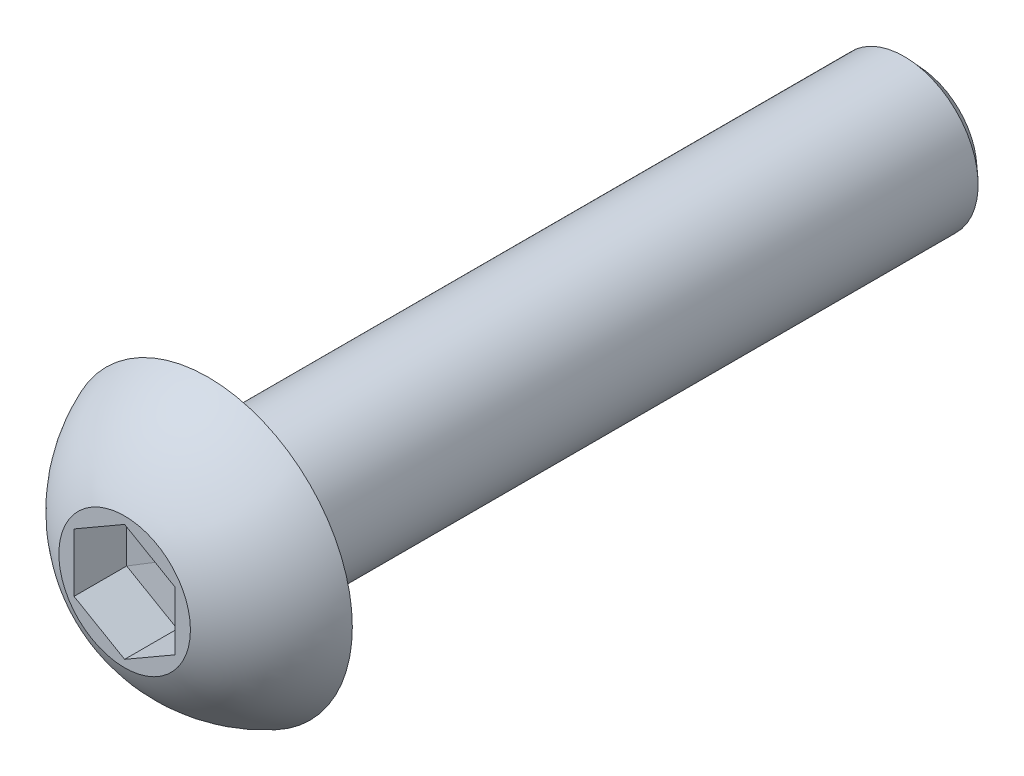
ISO-10303-21;
HEADER;
FILE_DESCRIPTION(('STEP AP214'),'2;1');
FILE_NAME('part.step','',(''),(''),'','','');
FILE_SCHEMA(('AUTOMOTIVE_DESIGN { 1 0 10303 214 1 1 1 1 }'));
ENDSEC;
DATA;
#1=APPLICATION_CONTEXT('core data for automotive mechanical design processes');
#2=APPLICATION_PROTOCOL_DEFINITION('international standard','automotive_design',2000,#1);
#3=PRODUCT_CONTEXT('',#1,'mechanical');
#4=PRODUCT('Part','Part','',(#3));
#5=PRODUCT_RELATED_PRODUCT_CATEGORY('part','',(#4));
#6=PRODUCT_DEFINITION_FORMATION('','',#4);
#7=PRODUCT_DEFINITION_CONTEXT('part definition',#1,'design');
#8=PRODUCT_DEFINITION('design','',#6,#7);
#9=PRODUCT_DEFINITION_SHAPE('','',#8);
#10=(LENGTH_UNIT() NAMED_UNIT(*) SI_UNIT(.MILLI.,.METRE.));
#11=(NAMED_UNIT(*) PLANE_ANGLE_UNIT() SI_UNIT($,.RADIAN.));
#12=(NAMED_UNIT(*) SI_UNIT($,.STERADIAN.) SOLID_ANGLE_UNIT());
#13=UNCERTAINTY_MEASURE_WITH_UNIT(LENGTH_MEASURE(1.E-05),#10,'distance_accuracy_value','');
#14=(GEOMETRIC_REPRESENTATION_CONTEXT(3) GLOBAL_UNCERTAINTY_ASSIGNED_CONTEXT((#13)) GLOBAL_UNIT_ASSIGNED_CONTEXT((#10,
#11,#12)) REPRESENTATION_CONTEXT('',''));
#15=CARTESIAN_POINT('',(0.,0.,0.));
#16=DIRECTION('',(0.,0.,1.));
#17=DIRECTION('',(1.,0.,0.));
#18=AXIS2_PLACEMENT_3D('',#15,#16,#17);
#19=CARTESIAN_POINT('',(0.,0.,-1.12424242424294));
#20=DIRECTION('',(0.,0.,1.));
#21=DIRECTION('',(1.,0.,0.));
#22=AXIS2_PLACEMENT_3D('',#19,#20,#21);
#23=SPHERICAL_SURFACE('',#22,3.06372665694355);
#24=CARTESIAN_POINT('',(0.,0.,-5.09960734214414E-13));
#25=DIRECTION('',(0.,0.,-1.));
#26=DIRECTION('',(1.,0.,0.));
#27=AXIS2_PLACEMENT_3D('',#24,#25,#26);
#28=CIRCLE('',#27,2.85);
#29=CARTESIAN_POINT('',(2.85,0.,-5.10659223240673E-13));
#30=VERTEX_POINT('',#29);
#31=EDGE_CURVE('E145',#30,#30,#28,.T.);
#32=CARTESIAN_POINT('',(0.,0.,1.64999999999949));
#33=DIRECTION('',(0.,0.,-1.));
#34=DIRECTION('',(1.,0.,0.));
#35=AXIS2_PLACEMENT_3D('',#32,#33,#34);
#36=CIRCLE('',#35,1.3);
#37=CARTESIAN_POINT('',(1.3,0.,1.64999999999949));
#38=VERTEX_POINT('',#37);
#39=EDGE_CURVE('E11',#38,#38,#36,.T.);
#40=CARTESIAN_POINT('',(2.85,0.,-5.10659223240673E-13));
#41=CARTESIAN_POINT('',(2.84113663386439,0.,0.0224691478443114));
#42=CARTESIAN_POINT('',(2.83200744713934,0.,0.0448334346416591));
#43=CARTESIAN_POINT('',(2.81322277135795,0.,0.0893398740639242));
#44=CARTESIAN_POINT('',(2.80356728230162,0.,0.111482026688841));
#45=CARTESIAN_POINT('',(2.7837353407053,0.,0.155531785688763));
#46=CARTESIAN_POINT('',(2.77355888816531,0.,0.177439392063768));
#47=CARTESIAN_POINT('',(2.75269072874913,0.,0.221007810980761));
#48=CARTESIAN_POINT('',(2.74199902187295,0.,0.24266862352275));
#49=CARTESIAN_POINT('',(2.7201063300164,0.,0.285731336320252));
#50=CARTESIAN_POINT('',(2.70890534503602,0.,0.307133236575766));
#51=CARTESIAN_POINT('',(2.68600036374538,0.,0.349666153566971));
#52=CARTESIAN_POINT('',(2.67429636743511,0.,0.370797170302663));
#53=CARTESIAN_POINT('',(2.65039191011457,0.,0.412776499906466));
#54=CARTESIAN_POINT('',(2.63819144910429,0.,0.433624812774579));
#55=CARTESIAN_POINT('',(2.61330088713136,0.,0.475027072605241));
#56=CARTESIAN_POINT('',(2.6006107861687,0.,0.495581019567789));
#57=CARTESIAN_POINT('',(2.57474804282317,0.,0.536383050164972));
#58=CARTESIAN_POINT('',(2.56157540044031,0.,0.556631133799606));
#59=CARTESIAN_POINT('',(2.53475494273848,0.,0.596810111423956));
#60=CARTESIAN_POINT('',(2.52110712741952,0.,0.616741005413671));
#61=CARTESIAN_POINT('',(2.49334395812279,0.,0.656274454856581));
#62=CARTESIAN_POINT('',(2.47922860414502,0.,0.675877010309776));
#63=CARTESIAN_POINT('',(2.45053825334057,0.,0.714742817454075));
#64=CARTESIAN_POINT('',(2.4359632565139,0.,0.734006069145179));
#65=CARTESIAN_POINT('',(2.40636177293482,0.,0.772182493338329));
#66=CARTESIAN_POINT('',(2.3913352861824,0.,0.791095665840376));
#67=CARTESIAN_POINT('',(2.36083922822839,0.,0.828561352054885));
#68=CARTESIAN_POINT('',(2.34536965702678,0.,0.847113865767347));
#69=CARTESIAN_POINT('',(2.31399608350231,0.,0.883847856546503));
#70=CARTESIAN_POINT('',(2.29809208117944,0.,0.902029333613197));
#71=CARTESIAN_POINT('',(2.2658585417513,0.,0.938011080794139));
#72=CARTESIAN_POINT('',(2.24952900464603,0.,0.955811350908387));
#73=CARTESIAN_POINT('',(2.21645353002648,0.,0.991020727116296));
#74=CARTESIAN_POINT('',(2.1997075925122,0.,1.00842983320996));
#75=CARTESIAN_POINT('',(2.16580868437298,0.,1.04284714311685));
#76=CARTESIAN_POINT('',(2.14865571374804,0.,1.05985534693008));
#77=CARTESIAN_POINT('',(2.11395233437096,0.,1.09346133827194));
#78=CARTESIAN_POINT('',(2.09640192561881,0.,1.11005912580056));
#79=CARTESIAN_POINT('',(2.06091348728868,0.,1.14283500014659));
#80=CARTESIAN_POINT('',(2.04297545771069,0.,1.15901308696401));
#81=CARTESIAN_POINT('',(2.00672181185651,0.,1.19094051023207));
#82=CARTESIAN_POINT('',(1.98840619558033,0.,1.20668984668272));
#83=CARTESIAN_POINT('',(1.95140762167093,0.,1.23775095939509));
#84=CARTESIAN_POINT('',(1.93272466403772,0.,1.25306273565682));
#85=CARTESIAN_POINT('',(1.89500185823761,0.,1.28324016292989));
#86=CARTESIAN_POINT('',(1.87596201007072,0.,1.29810581394125));
#87=CARTESIAN_POINT('',(1.83753607366409,0.,1.32738267520654));
#88=CARTESIAN_POINT('',(1.81814998542436,0.,1.34179388546048));
#89=CARTESIAN_POINT('',(1.77904241300796,0.,1.37015380390018));
#90=CARTESIAN_POINT('',(1.7593209288313,0.,1.38410251208594));
#91=CARTESIAN_POINT('',(1.71955359630399,0.,1.41152962382006));
#92=CARTESIAN_POINT('',(1.69950774795333,0.,1.42500802736843));
#93=CARTESIAN_POINT('',(1.65910290023023,0.,1.45148699023043));
#94=CARTESIAN_POINT('',(1.63874390085779,0.,1.46448754954408));
#95=CARTESIAN_POINT('',(1.59772413960959,0.,1.4900035520297));
#96=CARTESIAN_POINT('',(1.57706337773384,0.,1.50251899520168));
#97=CARTESIAN_POINT('',(1.5354516480626,0.,1.52705776338538));
#98=CARTESIAN_POINT('',(1.5145006802671,0.,1.53908108839711));
#99=CARTESIAN_POINT('',(1.47232026041398,0.,1.56262889902485));
#100=CARTESIAN_POINT('',(1.45109080835635,0.,1.57415338464086));
#101=CARTESIAN_POINT('',(1.40836528719074,0.,1.59669705374236));
#102=CARTESIAN_POINT('',(1.38686921808275,0.,1.60771623722784));
#103=CARTESIAN_POINT('',(1.34362251732278,0.,1.62924319863992));
#104=CARTESIAN_POINT('',(1.3218718856708,0.,1.63975097656652));
#105=CARTESIAN_POINT('',(1.3,0.,1.64999999999949));
#106=B_SPLINE_CURVE_WITH_KNOTS('',3,(#40,#41,#42,#43,#44,#45,#46,#47,#48,#49,#50,#51,#52,#53,
#54,#55,#56,#57,#58,#59,#60,#61,#62,#63,#64,#65,#66,#67,#68,#69,#70,#71,#72,#73,#74,#75,#76,#77,
#78,#79,#80,#81,#82,#83,#84,#85,#86,#87,#88,#89,#90,#91,#92,#93,#94,#95,#96,#97,#98,#99,#100,
#101,#102,#103,#104,#105),.UNSPECIFIED.,.F.,.F.,(4,2,2,2,2,2,2,2,2,2,2,2,2,2,2,2,2,2,2,2,2,2,2,
2,2,2,2,2,2,2,2,2,4),(0.,0.0724606888856509,0.144921377771302,0.217382066656953,
0.289842755542604,0.362303444428255,0.434764133313906,0.507224822199557,0.579685511085209,
0.652146199970859,0.72460688885651,0.797067577742162,0.869528266627813,0.941988955513463,
1.01444964439911,1.08691033328477,1.15937102217042,1.23183171105607,1.30429239994172,
1.37675308882737,1.44921377771302,1.52167446659867,1.59413515548432,1.66659584436997,
1.73905653325563,1.81151722214128,1.88397791102693,1.95643859991258,2.02889928879823,
2.10135997768388,2.17382066656953,2.24628135545518,2.31874204434083),.UNSPECIFIED.);
#107=EDGE_CURVE('BSEAM17',#30,#38,#106,.T.);
#108=ORIENTED_EDGE('',*,*,#31,.F.);
#109=ORIENTED_EDGE('',*,*,#39,.T.);
#110=ORIENTED_EDGE('',*,*,#107,.T.);
#111=ORIENTED_EDGE('',*,*,#107,.F.);
#112=EDGE_LOOP('',(#108,#110,#109,#111));
#113=FACE_BOUND('',#112,.T.);
#114=ADVANCED_FACE('F17',(#113),#23,.T.);
#115=CARTESIAN_POINT('',(-1.3,0.,1.64999999999949));
#116=DIRECTION('',(0.,0.,1.));
#117=DIRECTION('',(1.,0.,0.));
#118=AXIS2_PLACEMENT_3D('',#115,#116,#117);
#119=PLANE('',#118);
#120=DIRECTION('',(-0.866025403784439,-0.5,0.));
#121=VECTOR('',#120,1.);
#122=CARTESIAN_POINT('',(0.2625,-1.00314609271698,1.64999999999949));
#123=LINE('',#122,#121);
#124=CARTESIAN_POINT('',(1.,-0.577350269189626,1.65));
#125=VERTEX_POINT('',#124);
#126=CARTESIAN_POINT('',(0.,-1.15470053837925,1.65));
#127=VERTEX_POINT('',#126);
#128=EDGE_CURVE('E168',#125,#127,#123,.T.);
#129=ORIENTED_EDGE('',*,*,#128,.T.);
#130=DIRECTION('',(-0.866025403784439,0.5,0.));
#131=VECTOR('',#130,1.);
#132=CARTESIAN_POINT('',(-0.7375,-0.728904714851902,1.64999999999949));
#133=LINE('',#132,#131);
#134=CARTESIAN_POINT('',(-1.,-0.577350269189625,1.65));
#135=VERTEX_POINT('',#134);
#136=EDGE_CURVE('E25',#127,#135,#133,.T.);
#137=ORIENTED_EDGE('',*,*,#136,.T.);
#138=DIRECTION('',(0.,1.,0.));
#139=VECTOR('',#138,1.);
#140=CARTESIAN_POINT('',(-1.,-0.288675134594813,1.64999999999949));
#141=LINE('',#140,#139);
#142=CARTESIAN_POINT('',(-1.,0.577350269189626,1.65));
#143=VERTEX_POINT('',#142);
#144=EDGE_CURVE('E43',#135,#143,#141,.T.);
#145=ORIENTED_EDGE('',*,*,#144,.T.);
#146=DIRECTION('',(0.866025403784439,0.5,0.));
#147=VECTOR('',#146,1.);
#148=CARTESIAN_POINT('',(-1.2375,0.44022958025709,1.64999999999949));
#149=LINE('',#148,#147);
#150=CARTESIAN_POINT('',(0.,1.15470053837925,1.65));
#151=VERTEX_POINT('',#150);
#152=EDGE_CURVE('E185',#143,#151,#149,.T.);
#153=ORIENTED_EDGE('',*,*,#152,.T.);
#154=DIRECTION('',(0.866025403784439,-0.5,0.));
#155=VECTOR('',#154,1.);
#156=CARTESIAN_POINT('',(-0.2375,1.29182122731179,1.64999999999949));
#157=LINE('',#156,#155);
#158=CARTESIAN_POINT('',(1.,0.577350269189626,1.65));
#159=VERTEX_POINT('',#158);
#160=EDGE_CURVE('E176',#151,#159,#157,.T.);
#161=ORIENTED_EDGE('',*,*,#160,.T.);
#162=DIRECTION('',(0.,-1.,0.));
#163=VECTOR('',#162,1.);
#164=CARTESIAN_POINT('',(1.,0.288675134594813,1.64999999999949));
#165=LINE('',#164,#163);
#166=EDGE_CURVE('E175',#159,#125,#165,.T.);
#167=ORIENTED_EDGE('',*,*,#166,.T.);
#168=EDGE_LOOP('',(#129,#137,#145,#153,#161,#167));
#169=FACE_BOUND('',#168,.T.);
#170=ORIENTED_EDGE('',*,*,#39,.F.);
#171=EDGE_LOOP('',(#170));
#172=FACE_BOUND('',#171,.T.);
#173=ADVANCED_FACE('F377',(#169,#172),#119,.T.);
#174=CARTESIAN_POINT('',(0.,0.,-14.));
#175=DIRECTION('',(0.,0.,-1.));
#176=DIRECTION('',(-1.,0.,0.));
#177=AXIS2_PLACEMENT_3D('',#174,#175,#176);
#178=PLANE('',#177);
#179=CARTESIAN_POINT('',(0.,0.,-14.));
#180=DIRECTION('',(0.,0.,-1.));
#181=DIRECTION('',(-1.,0.,0.));
#182=AXIS2_PLACEMENT_3D('',#179,#180,#181);
#183=CIRCLE('',#182,1.193275);
#184=CARTESIAN_POINT('',(-1.193275,0.,-14.));
#185=VERTEX_POINT('',#184);
#186=EDGE_CURVE('E438',#185,#185,#183,.T.);
#187=ORIENTED_EDGE('',*,*,#186,.T.);
#188=EDGE_LOOP('',(#187));
#189=FACE_BOUND('',#188,.T.);
#190=ADVANCED_FACE('F367',(#189),#178,.T.);
#191=CARTESIAN_POINT('',(0.,-1.15470053837925,1.65));
#192=DIRECTION('',(-0.5,-0.866025403784439,0.));
#193=DIRECTION('',(-0.866025403784439,0.5,0.));
#194=AXIS2_PLACEMENT_3D('',#191,#192,#193);
#195=PLANE('',#194);
#196=ORIENTED_EDGE('',*,*,#136,.F.);
#197=DIRECTION('',(0.,0.,-1.));
#198=VECTOR('',#197,1.);
#199=CARTESIAN_POINT('',(0.,-1.15470053837925,1.65));
#200=LINE('',#199,#198);
#201=CARTESIAN_POINT('',(0.,-1.15470053837925,0.61));
#202=VERTEX_POINT('',#201);
#203=EDGE_CURVE('E172',#127,#202,#200,.T.);
#204=ORIENTED_EDGE('',*,*,#203,.T.);
#205=DIRECTION('',(-0.866025403784439,0.5,0.));
#206=VECTOR('',#205,1.);
#207=CARTESIAN_POINT('',(-1.,-0.577350269189625,0.61));
#208=LINE('',#207,#206);
#209=CARTESIAN_POINT('',(-1.,-0.577350269189625,0.61));
#210=VERTEX_POINT('',#209);
#211=EDGE_CURVE('E102',#202,#210,#208,.T.);
#212=ORIENTED_EDGE('',*,*,#211,.T.);
#213=DIRECTION('',(0.,0.,-1.));
#214=VECTOR('',#213,1.);
#215=CARTESIAN_POINT('',(-1.,-0.577350269189625,1.65));
#216=LINE('',#215,#214);
#217=EDGE_CURVE('E192',#135,#210,#216,.T.);
#218=ORIENTED_EDGE('',*,*,#217,.F.);
#219=EDGE_LOOP('',(#196,#204,#212,#218));
#220=FACE_BOUND('',#219,.T.);
#221=ADVANCED_FACE('F357',(#220),#195,.F.);
#222=CARTESIAN_POINT('',(-1.,-0.577350269189625,1.65));
#223=DIRECTION('',(-1.,0.,0.));
#224=DIRECTION('',(0.,0.,1.));
#225=AXIS2_PLACEMENT_3D('',#222,#223,#224);
#226=PLANE('',#225);
#227=ORIENTED_EDGE('',*,*,#144,.F.);
#228=ORIENTED_EDGE('',*,*,#217,.T.);
#229=DIRECTION('',(0.,1.,0.));
#230=VECTOR('',#229,1.);
#231=CARTESIAN_POINT('',(-1.,0.577350269189626,0.61));
#232=LINE('',#231,#230);
#233=CARTESIAN_POINT('',(-1.,0.577350269189626,0.61));
#234=VERTEX_POINT('',#233);
#235=EDGE_CURVE('E97',#210,#234,#232,.T.);
#236=ORIENTED_EDGE('',*,*,#235,.T.);
#237=DIRECTION('',(0.,0.,-1.));
#238=VECTOR('',#237,1.);
#239=CARTESIAN_POINT('',(-1.,0.577350269189626,1.65));
#240=LINE('',#239,#238);
#241=EDGE_CURVE('E188',#143,#234,#240,.T.);
#242=ORIENTED_EDGE('',*,*,#241,.F.);
#243=EDGE_LOOP('',(#227,#228,#236,#242));
#244=FACE_BOUND('',#243,.T.);
#245=ADVANCED_FACE('F345',(#244),#226,.F.);
#246=CARTESIAN_POINT('',(-1.,0.577350269189626,1.65));
#247=DIRECTION('',(-0.5,0.866025403784439,0.));
#248=DIRECTION('',(0.,0.,1.));
#249=AXIS2_PLACEMENT_3D('',#246,#247,#248);
#250=PLANE('',#249);
#251=ORIENTED_EDGE('',*,*,#152,.F.);
#252=ORIENTED_EDGE('',*,*,#241,.T.);
#253=DIRECTION('',(0.866025403784439,0.5,0.));
#254=VECTOR('',#253,1.);
#255=CARTESIAN_POINT('',(0.,1.15470053837925,0.61));
#256=LINE('',#255,#254);
#257=CARTESIAN_POINT('',(0.,1.15470053837925,0.61));
#258=VERTEX_POINT('',#257);
#259=EDGE_CURVE('E111',#234,#258,#256,.T.);
#260=ORIENTED_EDGE('',*,*,#259,.T.);
#261=DIRECTION('',(0.,0.,-1.));
#262=VECTOR('',#261,1.);
#263=CARTESIAN_POINT('',(0.,1.15470053837925,1.65));
#264=LINE('',#263,#262);
#265=EDGE_CURVE('E179',#151,#258,#264,.T.);
#266=ORIENTED_EDGE('',*,*,#265,.F.);
#267=EDGE_LOOP('',(#251,#252,#260,#266));
#268=FACE_BOUND('',#267,.T.);
#269=ADVANCED_FACE('F335',(#268),#250,.F.);
#270=CARTESIAN_POINT('',(0.,1.15470053837925,1.65));
#271=DIRECTION('',(0.5,0.866025403784439,0.));
#272=DIRECTION('',(0.,0.,-1.));
#273=AXIS2_PLACEMENT_3D('',#270,#271,#272);
#274=PLANE('',#273);
#275=ORIENTED_EDGE('',*,*,#160,.F.);
#276=ORIENTED_EDGE('',*,*,#265,.T.);
#277=DIRECTION('',(0.866025403784439,-0.5,0.));
#278=VECTOR('',#277,1.);
#279=CARTESIAN_POINT('',(1.,0.577350269189626,0.61));
#280=LINE('',#279,#278);
#281=CARTESIAN_POINT('',(1.,0.577350269189626,0.61));
#282=VERTEX_POINT('',#281);
#283=EDGE_CURVE('E121',#258,#282,#280,.T.);
#284=ORIENTED_EDGE('',*,*,#283,.T.);
#285=DIRECTION('',(0.,0.,-1.));
#286=VECTOR('',#285,1.);
#287=CARTESIAN_POINT('',(1.,0.577350269189626,1.65));
#288=LINE('',#287,#286);
#289=EDGE_CURVE('E180',#159,#282,#288,.T.);
#290=ORIENTED_EDGE('',*,*,#289,.F.);
#291=EDGE_LOOP('',(#275,#276,#284,#290));
#292=FACE_BOUND('',#291,.T.);
#293=ADVANCED_FACE('F325',(#292),#274,.F.);
#294=CARTESIAN_POINT('',(1.,0.577350269189626,1.65));
#295=DIRECTION('',(1.,0.,0.));
#296=DIRECTION('',(0.,1.,0.));
#297=AXIS2_PLACEMENT_3D('',#294,#295,#296);
#298=PLANE('',#297);
#299=ORIENTED_EDGE('',*,*,#166,.F.);
#300=ORIENTED_EDGE('',*,*,#289,.T.);
#301=DIRECTION('',(0.,-1.,0.));
#302=VECTOR('',#301,1.);
#303=CARTESIAN_POINT('',(1.,-0.577350269189626,0.61));
#304=LINE('',#303,#302);
#305=CARTESIAN_POINT('',(1.,-0.577350269189626,0.61));
#306=VERTEX_POINT('',#305);
#307=EDGE_CURVE('E131',#282,#306,#304,.T.);
#308=ORIENTED_EDGE('',*,*,#307,.T.);
#309=DIRECTION('',(0.,0.,-1.));
#310=VECTOR('',#309,1.);
#311=CARTESIAN_POINT('',(1.,-0.577350269189626,1.65));
#312=LINE('',#311,#310);
#313=EDGE_CURVE('E169',#125,#306,#312,.T.);
#314=ORIENTED_EDGE('',*,*,#313,.F.);
#315=EDGE_LOOP('',(#299,#300,#308,#314));
#316=FACE_BOUND('',#315,.T.);
#317=ADVANCED_FACE('F314',(#316),#298,.F.);
#318=CARTESIAN_POINT('',(1.,-0.577350269189626,1.65));
#319=DIRECTION('',(0.5,-0.866025403784439,0.));
#320=DIRECTION('',(0.,0.,-1.));
#321=AXIS2_PLACEMENT_3D('',#318,#319,#320);
#322=PLANE('',#321);
#323=ORIENTED_EDGE('',*,*,#128,.F.);
#324=ORIENTED_EDGE('',*,*,#313,.T.);
#325=DIRECTION('',(-0.866025403784439,-0.5,0.));
#326=VECTOR('',#325,1.);
#327=CARTESIAN_POINT('',(0.,-1.15470053837925,0.61));
#328=LINE('',#327,#326);
#329=EDGE_CURVE('E139',#306,#202,#328,.T.);
#330=ORIENTED_EDGE('',*,*,#329,.T.);
#331=ORIENTED_EDGE('',*,*,#203,.F.);
#332=EDGE_LOOP('',(#323,#324,#330,#331));
#333=FACE_BOUND('',#332,.T.);
#334=ADVANCED_FACE('F305',(#333),#322,.F.);
#335=CARTESIAN_POINT('',(-1.,-0.577350269189625,0.61));
#336=DIRECTION('',(-0.0435778713738291,-0.0754790873051733,-0.996194698091746));
#337=DIRECTION('',(0.,-0.997141949694317,0.0755508581011305));
#338=AXIS2_PLACEMENT_3D('',#335,#336,#337);
#339=PLANE('',#338);
#340=DIRECTION('',(0.863550259614423,0.498570974847158,-0.0755508581011305));
#341=VECTOR('',#340,1.);
#342=CARTESIAN_POINT('',(-0.751426983039954,-0.433836570934465,0.588252678957559));
#343=LINE('',#342,#341);
#344=CARTESIAN_POINT('',(0.,0.,0.522511336474076));
#345=VERTEX_POINT('',#344);
#346=EDGE_CURVE('E91',#210,#345,#343,.T.);
#347=ORIENTED_EDGE('',*,*,#346,.F.);
#348=ORIENTED_EDGE('',*,*,#211,.F.);
#349=DIRECTION('',(0.,0.997141949694317,-0.0755508581011306));
#350=VECTOR('',#349,1.);
#351=CARTESIAN_POINT('',(0.,-0.867673141868932,0.588252678957559));
#352=LINE('',#351,#350);
#353=EDGE_CURVE('E137',#202,#345,#352,.T.);
#354=ORIENTED_EDGE('',*,*,#353,.T.);
#355=EDGE_LOOP('',(#347,#348,#354));
#356=FACE_BOUND('',#355,.T.);
#357=ADVANCED_FACE('F142',(#356),#339,.F.);
#358=CARTESIAN_POINT('',(-1.,0.577350269189626,0.61));
#359=DIRECTION('',(-0.0871557427476581,0.,-0.996194698091746));
#360=DIRECTION('',(-0.996194698091746,0.,0.0871557427476581));
#361=AXIS2_PLACEMENT_3D('',#358,#359,#360);
#362=PLANE('',#361);
#363=DIRECTION('',(0.863550259614423,-0.498570974847159,-0.0755508581011305));
#364=VECTOR('',#363,1.);
#365=CARTESIAN_POINT('',(-0.751426983039954,0.433836570934466,0.588252678957559));
#366=LINE('',#365,#364);
#367=EDGE_CURVE('E94',#234,#345,#366,.T.);
#368=ORIENTED_EDGE('',*,*,#367,.F.);
#369=ORIENTED_EDGE('',*,*,#235,.F.);
#370=ORIENTED_EDGE('',*,*,#346,.T.);
#371=EDGE_LOOP('',(#368,#369,#370));
#372=FACE_BOUND('',#371,.T.);
#373=ADVANCED_FACE('F93',(#372),#362,.F.);
#374=CARTESIAN_POINT('',(0.,1.15470053837925,0.61));
#375=DIRECTION('',(-0.0435778713738291,0.0754790873051733,-0.996194698091746));
#376=DIRECTION('',(-0.999044587684655,0.,0.0437025378896691));
#377=AXIS2_PLACEMENT_3D('',#374,#375,#376);
#378=PLANE('',#377);
#379=DIRECTION('',(0.,-0.997141949694317,-0.0755508581011306));
#380=VECTOR('',#379,1.);
#381=CARTESIAN_POINT('',(0.,0.867673141868932,0.588252678957559));
#382=LINE('',#381,#380);
#383=EDGE_CURVE('E108',#258,#345,#382,.T.);
#384=ORIENTED_EDGE('',*,*,#383,.F.);
#385=ORIENTED_EDGE('',*,*,#259,.F.);
#386=ORIENTED_EDGE('',*,*,#367,.T.);
#387=EDGE_LOOP('',(#384,#385,#386));
#388=FACE_BOUND('',#387,.T.);
#389=ADVANCED_FACE('F107',(#388),#378,.F.);
#390=CARTESIAN_POINT('',(1.,0.577350269189626,0.61));
#391=DIRECTION('',(0.0435778713738291,0.0754790873051733,-0.996194698091746));
#392=DIRECTION('',(-0.999044587684655,0.,-0.0437025378896691));
#393=AXIS2_PLACEMENT_3D('',#390,#391,#392);
#394=PLANE('',#393);
#395=DIRECTION('',(-0.863550259614423,-0.498570974847158,-0.0755508581011305));
#396=VECTOR('',#395,1.);
#397=CARTESIAN_POINT('',(0.751426983039954,0.433836570934466,0.588252678957559));
#398=LINE('',#397,#396);
#399=EDGE_CURVE('E118',#282,#345,#398,.T.);
#400=ORIENTED_EDGE('',*,*,#399,.F.);
#401=ORIENTED_EDGE('',*,*,#283,.F.);
#402=ORIENTED_EDGE('',*,*,#383,.T.);
#403=EDGE_LOOP('',(#400,#401,#402));
#404=FACE_BOUND('',#403,.T.);
#405=ADVANCED_FACE('F117',(#404),#394,.F.);
#406=CARTESIAN_POINT('',(1.,-0.577350269189626,0.61));
#407=DIRECTION('',(0.0871557427476581,0.,-0.996194698091746));
#408=DIRECTION('',(0.,-1.,0.));
#409=AXIS2_PLACEMENT_3D('',#406,#407,#408);
#410=PLANE('',#409);
#411=DIRECTION('',(-0.863550259614423,0.498570974847158,-0.0755508581011305));
#412=VECTOR('',#411,1.);
#413=CARTESIAN_POINT('',(0.751426983039954,-0.433836570934466,0.588252678957559));
#414=LINE('',#413,#412);
#415=EDGE_CURVE('E128',#306,#345,#414,.T.);
#416=ORIENTED_EDGE('',*,*,#415,.F.);
#417=ORIENTED_EDGE('',*,*,#307,.F.);
#418=ORIENTED_EDGE('',*,*,#399,.T.);
#419=EDGE_LOOP('',(#416,#417,#418));
#420=FACE_BOUND('',#419,.T.);
#421=ADVANCED_FACE('F127',(#420),#410,.F.);
#422=CARTESIAN_POINT('',(0.,-1.15470053837925,0.61));
#423=DIRECTION('',(0.0435778713738291,-0.0754790873051733,-0.996194698091746));
#424=DIRECTION('',(0.,-0.997141949694317,0.0755508581011305));
#425=AXIS2_PLACEMENT_3D('',#422,#423,#424);
#426=PLANE('',#425);
#427=ORIENTED_EDGE('',*,*,#353,.F.);
#428=ORIENTED_EDGE('',*,*,#329,.F.);
#429=ORIENTED_EDGE('',*,*,#415,.T.);
#430=EDGE_LOOP('',(#427,#428,#429));
#431=FACE_BOUND('',#430,.T.);
#432=ADVANCED_FACE('F136',(#431),#426,.F.);
#433=CARTESIAN_POINT('',(0.,0.,-7.00000000000011));
#434=DIRECTION('',(0.,0.,-1.));
#435=DIRECTION('',(-1.,0.,0.));
#436=AXIS2_PLACEMENT_3D('',#433,#434,#435);
#437=CYLINDRICAL_SURFACE('',#436,1.4635);
#438=CARTESIAN_POINT('',(0.,0.,-0.300000000000217));
#439=DIRECTION('',(0.,0.,1.));
#440=DIRECTION('',(-1.,0.,0.));
#441=AXIS2_PLACEMENT_3D('',#438,#439,#440);
#442=CIRCLE('',#441,1.4635);
#443=CARTESIAN_POINT('',(-1.4635,0.,-0.300000000000217));
#444=VERTEX_POINT('',#443);
#445=EDGE_CURVE('E154',#444,#444,#442,.T.);
#446=ORIENTED_EDGE('',*,*,#445,.F.);
#447=EDGE_LOOP('',(#446));
#448=FACE_BOUND('',#447,.T.);
#449=CARTESIAN_POINT('',(0.,0.,-13.7538502839854));
#450=DIRECTION('',(0.,0.,1.));
#451=DIRECTION('',(-1.,0.,0.));
#452=AXIS2_PLACEMENT_3D('',#449,#450,#451);
#453=CIRCLE('',#452,1.4635);
#454=CARTESIAN_POINT('',(-1.4635,0.,-13.7538502839854));
#455=VERTEX_POINT('',#454);
#456=EDGE_CURVE('E456',#455,#455,#453,.T.);
#457=ORIENTED_EDGE('',*,*,#456,.T.);
#458=EDGE_LOOP('',(#457));
#459=FACE_BOUND('',#458,.T.);
#460=ADVANCED_FACE('F239',(#448,#459),#437,.T.);
#461=CARTESIAN_POINT('',(-1.5,0.,-2.17010089795198E-13));
#462=DIRECTION('',(0.,0.,-1.));
#463=DIRECTION('',(-1.,0.,0.));
#464=AXIS2_PLACEMENT_3D('',#461,#462,#463);
#465=PLANE('',#464);
#466=CARTESIAN_POINT('',(0.,0.,-2.17430240478933E-13));
#467=DIRECTION('',(0.,0.,-1.));
#468=DIRECTION('',(-1.,0.,0.));
#469=AXIS2_PLACEMENT_3D('',#466,#467,#468);
#470=CIRCLE('',#469,1.7635);
#471=CARTESIAN_POINT('',(-1.7635,0.,-2.16944690426707E-13));
#472=VERTEX_POINT('',#471);
#473=EDGE_CURVE('E443',#472,#472,#470,.T.);
#474=ORIENTED_EDGE('',*,*,#473,.F.);
#475=EDGE_LOOP('',(#474));
#476=FACE_BOUND('',#475,.T.);
#477=ORIENTED_EDGE('',*,*,#31,.T.);
#478=EDGE_LOOP('',(#477));
#479=FACE_BOUND('',#478,.T.);
#480=ADVANCED_FACE('F227',(#476,#479),#465,.T.);
#481=CARTESIAN_POINT('',(0.,0.,-0.300000000000217));
#482=DIRECTION('',(0.,0.,-1.));
#483=DIRECTION('',(-1.,0.,0.));
#484=AXIS2_PLACEMENT_3D('',#481,#482,#483);
#485=TOROIDAL_SURFACE('',#484,1.7635,0.3);
#486=ORIENTED_EDGE('',*,*,#445,.T.);
#487=EDGE_LOOP('',(#486));
#488=FACE_BOUND('',#487,.T.);
#489=ORIENTED_EDGE('',*,*,#473,.T.);
#490=EDGE_LOOP('',(#489));
#491=FACE_BOUND('',#490,.T.);
#492=ADVANCED_FACE('F214',(#488,#491),#485,.F.);
#493=CARTESIAN_POINT('',(0.,0.,-13.8466375));
#494=DIRECTION('',(0.,0.,1.));
#495=DIRECTION('',(-1.,0.,0.));
#496=AXIS2_PLACEMENT_3D('',#493,#494,#495);
#497=CONICAL_SURFACE('',#496,1.3616375,0.831988093682998);
#498=ORIENTED_EDGE('',*,*,#186,.F.);
#499=EDGE_LOOP('',(#498));
#500=FACE_BOUND('',#499,.T.);
#501=ORIENTED_EDGE('',*,*,#456,.F.);
#502=EDGE_LOOP('',(#501));
#503=FACE_BOUND('',#502,.T.);
#504=ADVANCED_FACE('F208',(#500,#503),#497,.T.);
#505=CLOSED_SHELL('',(#114,#173,#190,#221,#245,#269,#293,#317,#334,#357,#373,#389,#405,#421,
#432,#460,#480,#492,#504));
#506=MANIFOLD_SOLID_BREP('B1',#505);
#507=ADVANCED_BREP_SHAPE_REPRESENTATION('',(#18,#506),#14);
#508=SHAPE_DEFINITION_REPRESENTATION(#9,#507);
ENDSEC;
END-ISO-10303-21;
